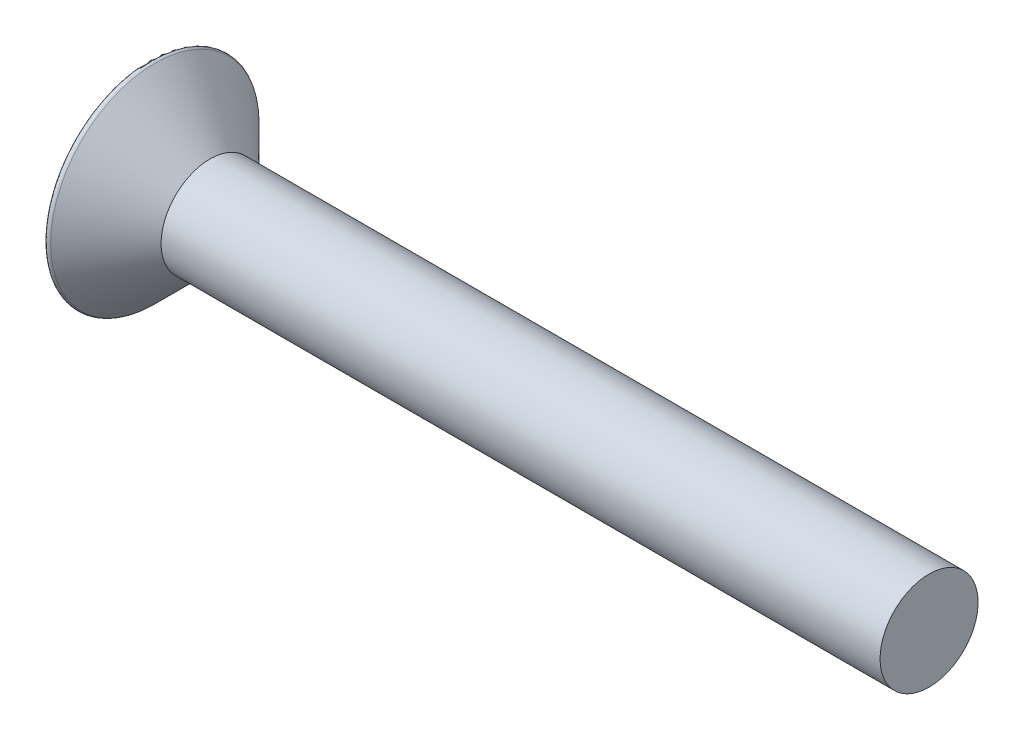
ISO-10303-21;
HEADER;
FILE_DESCRIPTION(('STEP AP214'),'2;1');
FILE_NAME('part.step','',(''),(''),'','','');
FILE_SCHEMA(('AUTOMOTIVE_DESIGN { 1 0 10303 214 1 1 1 1 }'));
ENDSEC;
DATA;
#1=APPLICATION_CONTEXT('core data for automotive mechanical design processes');
#2=APPLICATION_PROTOCOL_DEFINITION('international standard','automotive_design',2000,#1);
#3=PRODUCT_CONTEXT('',#1,'mechanical');
#4=PRODUCT('Part','Part','',(#3));
#5=PRODUCT_RELATED_PRODUCT_CATEGORY('part','',(#4));
#6=PRODUCT_DEFINITION_FORMATION('','',#4);
#7=PRODUCT_DEFINITION_CONTEXT('part definition',#1,'design');
#8=PRODUCT_DEFINITION('design','',#6,#7);
#9=PRODUCT_DEFINITION_SHAPE('','',#8);
#10=(LENGTH_UNIT() NAMED_UNIT(*) SI_UNIT(.MILLI.,.METRE.));
#11=(NAMED_UNIT(*) PLANE_ANGLE_UNIT() SI_UNIT($,.RADIAN.));
#12=(NAMED_UNIT(*) SI_UNIT($,.STERADIAN.) SOLID_ANGLE_UNIT());
#13=UNCERTAINTY_MEASURE_WITH_UNIT(LENGTH_MEASURE(1.E-05),#10,'distance_accuracy_value','');
#14=(GEOMETRIC_REPRESENTATION_CONTEXT(3) GLOBAL_UNCERTAINTY_ASSIGNED_CONTEXT((#13)) GLOBAL_UNIT_ASSIGNED_CONTEXT((#10,
#11,#12)) REPRESENTATION_CONTEXT('',''));
#15=CARTESIAN_POINT('',(0.,0.,0.));
#16=DIRECTION('',(0.,0.,1.));
#17=DIRECTION('',(1.,0.,0.));
#18=AXIS2_PLACEMENT_3D('',#15,#16,#17);
#19=CARTESIAN_POINT('',(0.,0.,0.));
#20=DIRECTION('',(1.,0.,0.));
#21=DIRECTION('',(0.,0.,-1.));
#22=AXIS2_PLACEMENT_3D('',#19,#20,#21);
#23=PLANE('',#22);
#24=CARTESIAN_POINT('',(0.,0.,0.));
#25=DIRECTION('',(1.,0.,0.));
#26=DIRECTION('',(0.,0.,-1.));
#27=AXIS2_PLACEMENT_3D('',#24,#25,#26);
#28=CIRCLE('',#27,3.11857864376269);
#29=CARTESIAN_POINT('',(0.,0.,-3.11857864376269));
#30=VERTEX_POINT('',#29);
#31=EDGE_CURVE('E47',#30,#30,#28,.F.);
#32=ORIENTED_EDGE('',*,*,#31,.T.);
#33=EDGE_LOOP('',(#32));
#34=FACE_BOUND('',#33,.T.);
#35=ADVANCED_FACE('F39',(#34),#23,.F.);
#36=CARTESIAN_POINT('',(1.86,0.,0.));
#37=DIRECTION('',(-1.,0.,0.));
#38=DIRECTION('',(0.,0.,1.));
#39=AXIS2_PLACEMENT_3D('',#36,#37,#38);
#40=CONICAL_SURFACE('',#39,1.49999999999999,0.78539816339745);
#41=CARTESIAN_POINT('',(0.170710678118655,0.,0.));
#42=DIRECTION('',(1.,0.,0.));
#43=DIRECTION('',(0.,0.,-1.));
#44=AXIS2_PLACEMENT_3D('',#41,#42,#43);
#45=CIRCLE('',#44,3.18928932188134);
#46=CARTESIAN_POINT('',(0.170710678118655,0.,-3.18928932188134));
#47=VERTEX_POINT('',#46);
#48=EDGE_CURVE('E10',#47,#47,#45,.T.);
#49=ORIENTED_EDGE('',*,*,#48,.T.);
#50=EDGE_LOOP('',(#49));
#51=FACE_BOUND('',#50,.T.);
#52=CARTESIAN_POINT('',(1.86,0.,0.));
#53=DIRECTION('',(-1.,0.,0.));
#54=DIRECTION('',(0.,0.,1.));
#55=AXIS2_PLACEMENT_3D('',#52,#53,#54);
#56=CIRCLE('',#55,1.49999999999999);
#57=CARTESIAN_POINT('',(1.86,0.,1.49999999999999));
#58=VERTEX_POINT('',#57);
#59=EDGE_CURVE('E52',#58,#58,#56,.T.);
#60=ORIENTED_EDGE('',*,*,#59,.T.);
#61=EDGE_LOOP('',(#60));
#62=FACE_BOUND('',#61,.T.);
#63=ADVANCED_FACE('F74',(#51,#62),#40,.T.);
#64=CARTESIAN_POINT('',(0.,0.,0.));
#65=DIRECTION('',(-1.,0.,0.));
#66=DIRECTION('',(0.,0.,1.));
#67=AXIS2_PLACEMENT_3D('',#64,#65,#66);
#68=CYLINDRICAL_SURFACE('',#67,1.49999999999999);
#69=ORIENTED_EDGE('',*,*,#59,.F.);
#70=EDGE_LOOP('',(#69));
#71=FACE_BOUND('',#70,.T.);
#72=CARTESIAN_POINT('',(23.86,0.,0.));
#73=DIRECTION('',(-1.,0.,0.));
#74=DIRECTION('',(0.,0.,1.));
#75=AXIS2_PLACEMENT_3D('',#72,#73,#74);
#76=CIRCLE('',#75,1.49999999999999);
#77=CARTESIAN_POINT('',(23.86,0.,1.49999999999999));
#78=VERTEX_POINT('',#77);
#79=EDGE_CURVE('E57',#78,#78,#76,.T.);
#80=ORIENTED_EDGE('',*,*,#79,.T.);
#81=EDGE_LOOP('',(#80));
#82=FACE_BOUND('',#81,.T.);
#83=ADVANCED_FACE('F64',(#71,#82),#68,.T.);
#84=CARTESIAN_POINT('',(23.86,1.49999999999999,0.));
#85=DIRECTION('',(-1.,0.,0.));
#86=DIRECTION('',(0.,0.,1.));
#87=AXIS2_PLACEMENT_3D('',#84,#85,#86);
#88=PLANE('',#87);
#89=ORIENTED_EDGE('',*,*,#79,.F.);
#90=EDGE_LOOP('',(#89));
#91=FACE_BOUND('',#90,.T.);
#92=ADVANCED_FACE('F66',(#91),#88,.F.);
#93=CARTESIAN_POINT('',(0.1,0.,0.));
#94=DIRECTION('',(1.,0.,0.));
#95=DIRECTION('',(0.,0.,-1.));
#96=AXIS2_PLACEMENT_3D('',#93,#94,#95);
#97=TOROIDAL_SURFACE('',#96,3.11857864376269,0.1);
#98=ORIENTED_EDGE('',*,*,#48,.F.);
#99=EDGE_LOOP('',(#98));
#100=FACE_BOUND('',#99,.T.);
#101=ORIENTED_EDGE('',*,*,#31,.F.);
#102=EDGE_LOOP('',(#101));
#103=FACE_BOUND('',#102,.T.);
#104=ADVANCED_FACE('F41',(#100,#103),#97,.T.);
#105=CLOSED_SHELL('',(#35,#63,#83,#92,#104));
#106=MANIFOLD_SOLID_BREP('B2',#105);
#107=ADVANCED_BREP_SHAPE_REPRESENTATION('',(#18,#106),#14);
#108=SHAPE_DEFINITION_REPRESENTATION(#9,#107);
ENDSEC;
END-ISO-10303-21;
